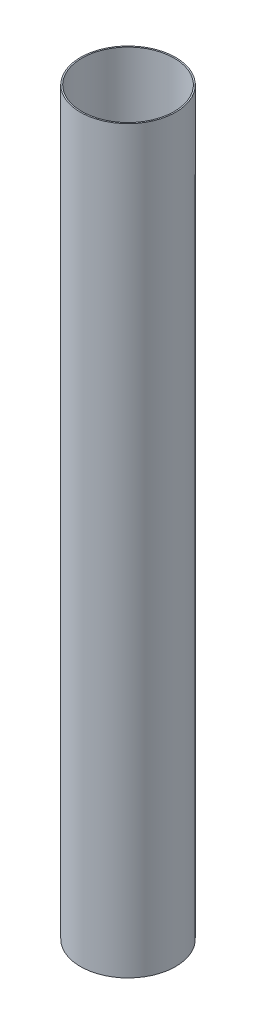
ISO-10303-21;
HEADER;
FILE_DESCRIPTION(('STEP AP214'),'2;1');
FILE_NAME('part.step','',(''),(''),'','','');
FILE_SCHEMA(('AUTOMOTIVE_DESIGN { 1 0 10303 214 1 1 1 1 }'));
ENDSEC;
DATA;
#1=APPLICATION_CONTEXT('core data for automotive mechanical design processes');
#2=APPLICATION_PROTOCOL_DEFINITION('international standard','automotive_design',2000,#1);
#3=PRODUCT_CONTEXT('',#1,'mechanical');
#4=PRODUCT('Part','Part','',(#3));
#5=PRODUCT_RELATED_PRODUCT_CATEGORY('part','',(#4));
#6=PRODUCT_DEFINITION_FORMATION('','',#4);
#7=PRODUCT_DEFINITION_CONTEXT('part definition',#1,'design');
#8=PRODUCT_DEFINITION('design','',#6,#7);
#9=PRODUCT_DEFINITION_SHAPE('','',#8);
#10=(LENGTH_UNIT() NAMED_UNIT(*) SI_UNIT(.MILLI.,.METRE.));
#11=(NAMED_UNIT(*) PLANE_ANGLE_UNIT() SI_UNIT($,.RADIAN.));
#12=(NAMED_UNIT(*) SI_UNIT($,.STERADIAN.) SOLID_ANGLE_UNIT());
#13=UNCERTAINTY_MEASURE_WITH_UNIT(LENGTH_MEASURE(1.E-05),#10,'distance_accuracy_value','');
#14=(GEOMETRIC_REPRESENTATION_CONTEXT(3) GLOBAL_UNCERTAINTY_ASSIGNED_CONTEXT((#13)) GLOBAL_UNIT_ASSIGNED_CONTEXT((#10,
#11,#12)) REPRESENTATION_CONTEXT('',''));
#15=CARTESIAN_POINT('',(0.,0.,0.));
#16=DIRECTION('',(0.,0.,1.));
#17=DIRECTION('',(1.,0.,0.));
#18=AXIS2_PLACEMENT_3D('',#15,#16,#17);
#19=CARTESIAN_POINT('',(0.,1219.2,0.));
#20=DIRECTION('',(0.,1.,0.));
#21=DIRECTION('',(0.,0.,1.));
#22=AXIS2_PLACEMENT_3D('',#19,#20,#21);
#23=PLANE('',#22);
#24=CARTESIAN_POINT('',(0.,1219.2,0.));
#25=DIRECTION('',(0.,1.,0.));
#26=DIRECTION('',(0.,0.,1.));
#27=AXIS2_PLACEMENT_3D('',#24,#25,#26);
#28=CIRCLE('',#27,78.4225);
#29=CARTESIAN_POINT('',(0.,1219.2,-78.4225));
#30=VERTEX_POINT('',#29);
#31=EDGE_CURVE('E10',#30,#30,#28,.T.);
#32=ORIENTED_EDGE('',*,*,#31,.T.);
#33=EDGE_LOOP('',(#32));
#34=FACE_BOUND('',#33,.T.);
#35=CARTESIAN_POINT('',(0.,1219.2,0.));
#36=DIRECTION('',(0.,1.,0.));
#37=DIRECTION('',(0.,0.,1.));
#38=AXIS2_PLACEMENT_3D('',#35,#36,#37);
#39=CIRCLE('',#38,76.2);
#40=CARTESIAN_POINT('',(0.,1219.2,-76.2));
#41=VERTEX_POINT('',#40);
#42=EDGE_CURVE('E46',#41,#41,#39,.T.);
#43=ORIENTED_EDGE('',*,*,#42,.F.);
#44=EDGE_LOOP('',(#43));
#45=FACE_BOUND('',#44,.T.);
#46=ADVANCED_FACE('F35',(#34,#45),#23,.T.);
#47=CARTESIAN_POINT('',(0.,0.,0.));
#48=DIRECTION('',(0.,1.,0.));
#49=DIRECTION('',(0.,0.,1.));
#50=AXIS2_PLACEMENT_3D('',#47,#48,#49);
#51=PLANE('',#50);
#52=CARTESIAN_POINT('',(0.,0.,0.));
#53=DIRECTION('',(0.,1.,0.));
#54=DIRECTION('',(0.,0.,1.));
#55=AXIS2_PLACEMENT_3D('',#52,#53,#54);
#56=CIRCLE('',#55,78.4225);
#57=CARTESIAN_POINT('',(0.,0.,-78.4225));
#58=VERTEX_POINT('',#57);
#59=EDGE_CURVE('E39',#58,#58,#56,.T.);
#60=ORIENTED_EDGE('',*,*,#59,.F.);
#61=EDGE_LOOP('',(#60));
#62=FACE_BOUND('',#61,.T.);
#63=CARTESIAN_POINT('',(0.,0.,0.));
#64=DIRECTION('',(0.,1.,0.));
#65=DIRECTION('',(0.,0.,1.));
#66=AXIS2_PLACEMENT_3D('',#63,#64,#65);
#67=CIRCLE('',#66,76.2);
#68=CARTESIAN_POINT('',(0.,0.,-76.2));
#69=VERTEX_POINT('',#68);
#70=EDGE_CURVE('E48',#69,#69,#67,.T.);
#71=ORIENTED_EDGE('',*,*,#70,.T.);
#72=EDGE_LOOP('',(#71));
#73=FACE_BOUND('',#72,.T.);
#74=ADVANCED_FACE('F58',(#62,#73),#51,.F.);
#75=CARTESIAN_POINT('',(0.,1219.2,0.));
#76=DIRECTION('',(0.,-1.,0.));
#77=DIRECTION('',(0.,0.,-1.));
#78=AXIS2_PLACEMENT_3D('',#75,#76,#77);
#79=CYLINDRICAL_SURFACE('',#78,78.4225);
#80=CARTESIAN_POINT('',(0.,1219.2,-78.4225));
#81=CARTESIAN_POINT('',(0.,1206.5,-78.4225));
#82=CARTESIAN_POINT('',(0.,1193.8,-78.4225));
#83=CARTESIAN_POINT('',(0.,1168.4,-78.4225));
#84=CARTESIAN_POINT('',(0.,1155.7,-78.4225));
#85=CARTESIAN_POINT('',(0.,1130.3,-78.4225));
#86=CARTESIAN_POINT('',(0.,1117.6,-78.4225));
#87=CARTESIAN_POINT('',(0.,1092.2,-78.4225));
#88=CARTESIAN_POINT('',(0.,1079.5,-78.4225));
#89=CARTESIAN_POINT('',(0.,1054.1,-78.4225));
#90=CARTESIAN_POINT('',(0.,1041.4,-78.4225));
#91=CARTESIAN_POINT('',(0.,1016.,-78.4225));
#92=CARTESIAN_POINT('',(0.,1003.3,-78.4225));
#93=CARTESIAN_POINT('',(0.,977.9,-78.4225));
#94=CARTESIAN_POINT('',(0.,965.2,-78.4225));
#95=CARTESIAN_POINT('',(0.,939.8,-78.4225));
#96=CARTESIAN_POINT('',(0.,927.1,-78.4225));
#97=CARTESIAN_POINT('',(0.,901.7,-78.4225));
#98=CARTESIAN_POINT('',(0.,889.,-78.4225));
#99=CARTESIAN_POINT('',(0.,863.6,-78.4225));
#100=CARTESIAN_POINT('',(0.,850.9,-78.4225));
#101=CARTESIAN_POINT('',(0.,825.5,-78.4225));
#102=CARTESIAN_POINT('',(0.,812.8,-78.4225));
#103=CARTESIAN_POINT('',(0.,787.4,-78.4225));
#104=CARTESIAN_POINT('',(0.,774.7,-78.4225));
#105=CARTESIAN_POINT('',(0.,749.3,-78.4225));
#106=CARTESIAN_POINT('',(0.,736.6,-78.4225));
#107=CARTESIAN_POINT('',(0.,711.2,-78.4225));
#108=CARTESIAN_POINT('',(0.,698.5,-78.4225));
#109=CARTESIAN_POINT('',(0.,673.1,-78.4225));
#110=CARTESIAN_POINT('',(0.,660.4,-78.4225));
#111=CARTESIAN_POINT('',(0.,635.,-78.4225));
#112=CARTESIAN_POINT('',(0.,622.3,-78.4225));
#113=CARTESIAN_POINT('',(0.,596.9,-78.4225));
#114=CARTESIAN_POINT('',(0.,584.2,-78.4225));
#115=CARTESIAN_POINT('',(0.,558.8,-78.4225));
#116=CARTESIAN_POINT('',(0.,546.1,-78.4225));
#117=CARTESIAN_POINT('',(0.,520.7,-78.4225));
#118=CARTESIAN_POINT('',(0.,508.,-78.4225));
#119=CARTESIAN_POINT('',(0.,482.6,-78.4225));
#120=CARTESIAN_POINT('',(0.,469.9,-78.4225));
#121=CARTESIAN_POINT('',(0.,444.5,-78.4225));
#122=CARTESIAN_POINT('',(0.,431.8,-78.4225));
#123=CARTESIAN_POINT('',(0.,406.4,-78.4225));
#124=CARTESIAN_POINT('',(0.,393.7,-78.4225));
#125=CARTESIAN_POINT('',(0.,368.3,-78.4225));
#126=CARTESIAN_POINT('',(0.,355.6,-78.4225));
#127=CARTESIAN_POINT('',(0.,330.2,-78.4225));
#128=CARTESIAN_POINT('',(0.,317.5,-78.4225));
#129=CARTESIAN_POINT('',(0.,292.1,-78.4225));
#130=CARTESIAN_POINT('',(0.,279.4,-78.4225));
#131=CARTESIAN_POINT('',(0.,254.,-78.4225));
#132=CARTESIAN_POINT('',(0.,241.3,-78.4225));
#133=CARTESIAN_POINT('',(0.,215.9,-78.4225));
#134=CARTESIAN_POINT('',(0.,203.2,-78.4225));
#135=CARTESIAN_POINT('',(0.,177.8,-78.4225));
#136=CARTESIAN_POINT('',(0.,165.1,-78.4225));
#137=CARTESIAN_POINT('',(0.,139.7,-78.4225));
#138=CARTESIAN_POINT('',(0.,127.,-78.4225));
#139=CARTESIAN_POINT('',(0.,101.6,-78.4225));
#140=CARTESIAN_POINT('',(0.,88.9,-78.4225));
#141=CARTESIAN_POINT('',(0.,63.5,-78.4225));
#142=CARTESIAN_POINT('',(0.,50.8,-78.4225));
#143=CARTESIAN_POINT('',(0.,25.4,-78.4225));
#144=CARTESIAN_POINT('',(0.,12.7,-78.4225));
#145=CARTESIAN_POINT('',(0.,0.,-78.4225));
#146=B_SPLINE_CURVE_WITH_KNOTS('',3,(#80,#81,#82,#83,#84,#85,#86,#87,#88,#89,#90,#91,#92,#93,
#94,#95,#96,#97,#98,#99,#100,#101,#102,#103,#104,#105,#106,#107,#108,#109,#110,#111,#112,#113,
#114,#115,#116,#117,#118,#119,#120,#121,#122,#123,#124,#125,#126,#127,#128,#129,#130,#131,#132,
#133,#134,#135,#136,#137,#138,#139,#140,#141,#142,#143,#144,#145),.UNSPECIFIED.,.F.,.F.,(4,2,2,
2,2,2,2,2,2,2,2,2,2,2,2,2,2,2,2,2,2,2,2,2,2,2,2,2,2,2,2,2,4),(0.,38.1,76.2,114.3,152.4,190.5,
228.6,266.7,304.8,342.9,381.,419.1,457.2,495.3,533.4,571.5,609.6,647.7,685.8,723.9,762.,800.1,
838.2,876.3,914.4,952.5,990.6,1028.7,1066.8,1104.9,1143.,1181.1,1219.2),.UNSPECIFIED.);
#147=EDGE_CURVE('BSEAM37',#30,#58,#146,.T.);
#148=ORIENTED_EDGE('',*,*,#31,.F.);
#149=ORIENTED_EDGE('',*,*,#59,.T.);
#150=ORIENTED_EDGE('',*,*,#147,.T.);
#151=ORIENTED_EDGE('',*,*,#147,.F.);
#152=EDGE_LOOP('',(#148,#150,#149,#151));
#153=FACE_BOUND('',#152,.T.);
#154=ADVANCED_FACE('F37',(#153),#79,.T.);
#155=CARTESIAN_POINT('',(0.,1219.2,0.));
#156=DIRECTION('',(0.,-1.,0.));
#157=DIRECTION('',(0.,0.,-1.));
#158=AXIS2_PLACEMENT_3D('',#155,#156,#157);
#159=CYLINDRICAL_SURFACE('',#158,76.2);
#160=CARTESIAN_POINT('',(0.,1219.2,-76.2));
#161=CARTESIAN_POINT('',(0.,1206.5,-76.2));
#162=CARTESIAN_POINT('',(0.,1193.8,-76.2));
#163=CARTESIAN_POINT('',(0.,1168.4,-76.2));
#164=CARTESIAN_POINT('',(0.,1155.7,-76.2));
#165=CARTESIAN_POINT('',(0.,1130.3,-76.2));
#166=CARTESIAN_POINT('',(0.,1117.6,-76.2));
#167=CARTESIAN_POINT('',(0.,1092.2,-76.2));
#168=CARTESIAN_POINT('',(0.,1079.5,-76.2));
#169=CARTESIAN_POINT('',(0.,1054.1,-76.2));
#170=CARTESIAN_POINT('',(0.,1041.4,-76.2));
#171=CARTESIAN_POINT('',(0.,1016.,-76.2));
#172=CARTESIAN_POINT('',(0.,1003.3,-76.2));
#173=CARTESIAN_POINT('',(0.,977.9,-76.2));
#174=CARTESIAN_POINT('',(0.,965.2,-76.2));
#175=CARTESIAN_POINT('',(0.,939.8,-76.2));
#176=CARTESIAN_POINT('',(0.,927.1,-76.2));
#177=CARTESIAN_POINT('',(0.,901.7,-76.2));
#178=CARTESIAN_POINT('',(0.,889.,-76.2));
#179=CARTESIAN_POINT('',(0.,863.6,-76.2));
#180=CARTESIAN_POINT('',(0.,850.9,-76.2));
#181=CARTESIAN_POINT('',(0.,825.5,-76.2));
#182=CARTESIAN_POINT('',(0.,812.8,-76.2));
#183=CARTESIAN_POINT('',(0.,787.4,-76.2));
#184=CARTESIAN_POINT('',(0.,774.7,-76.2));
#185=CARTESIAN_POINT('',(0.,749.3,-76.2));
#186=CARTESIAN_POINT('',(0.,736.6,-76.2));
#187=CARTESIAN_POINT('',(0.,711.2,-76.2));
#188=CARTESIAN_POINT('',(0.,698.5,-76.2));
#189=CARTESIAN_POINT('',(0.,673.1,-76.2));
#190=CARTESIAN_POINT('',(0.,660.4,-76.2));
#191=CARTESIAN_POINT('',(0.,635.,-76.2));
#192=CARTESIAN_POINT('',(0.,622.3,-76.2));
#193=CARTESIAN_POINT('',(0.,596.9,-76.2));
#194=CARTESIAN_POINT('',(0.,584.2,-76.2));
#195=CARTESIAN_POINT('',(0.,558.8,-76.2));
#196=CARTESIAN_POINT('',(0.,546.1,-76.2));
#197=CARTESIAN_POINT('',(0.,520.7,-76.2));
#198=CARTESIAN_POINT('',(0.,508.,-76.2));
#199=CARTESIAN_POINT('',(0.,482.6,-76.2));
#200=CARTESIAN_POINT('',(0.,469.9,-76.2));
#201=CARTESIAN_POINT('',(0.,444.5,-76.2));
#202=CARTESIAN_POINT('',(0.,431.8,-76.2));
#203=CARTESIAN_POINT('',(0.,406.4,-76.2));
#204=CARTESIAN_POINT('',(0.,393.7,-76.2));
#205=CARTESIAN_POINT('',(0.,368.3,-76.2));
#206=CARTESIAN_POINT('',(0.,355.6,-76.2));
#207=CARTESIAN_POINT('',(0.,330.2,-76.2));
#208=CARTESIAN_POINT('',(0.,317.5,-76.2));
#209=CARTESIAN_POINT('',(0.,292.1,-76.2));
#210=CARTESIAN_POINT('',(0.,279.4,-76.2));
#211=CARTESIAN_POINT('',(0.,254.,-76.2));
#212=CARTESIAN_POINT('',(0.,241.3,-76.2));
#213=CARTESIAN_POINT('',(0.,215.9,-76.2));
#214=CARTESIAN_POINT('',(0.,203.2,-76.2));
#215=CARTESIAN_POINT('',(0.,177.8,-76.2));
#216=CARTESIAN_POINT('',(0.,165.1,-76.2));
#217=CARTESIAN_POINT('',(0.,139.7,-76.2));
#218=CARTESIAN_POINT('',(0.,127.,-76.2));
#219=CARTESIAN_POINT('',(0.,101.6,-76.2));
#220=CARTESIAN_POINT('',(0.,88.9,-76.2));
#221=CARTESIAN_POINT('',(0.,63.5,-76.2));
#222=CARTESIAN_POINT('',(0.,50.8,-76.2));
#223=CARTESIAN_POINT('',(0.,25.4,-76.2));
#224=CARTESIAN_POINT('',(0.,12.7,-76.2));
#225=CARTESIAN_POINT('',(0.,0.,-76.2));
#226=B_SPLINE_CURVE_WITH_KNOTS('',3,(#160,#161,#162,#163,#164,#165,#166,#167,#168,#169,#170,
#171,#172,#173,#174,#175,#176,#177,#178,#179,#180,#181,#182,#183,#184,#185,#186,#187,#188,#189,
#190,#191,#192,#193,#194,#195,#196,#197,#198,#199,#200,#201,#202,#203,#204,#205,#206,#207,#208,
#209,#210,#211,#212,#213,#214,#215,#216,#217,#218,#219,#220,#221,#222,#223,#224,#225),
.UNSPECIFIED.,.F.,.F.,(4,2,2,2,2,2,2,2,2,2,2,2,2,2,2,2,2,2,2,2,2,2,2,2,2,2,2,2,2,2,2,2,4),(0.,
38.1,76.2,114.3,152.4,190.5,228.6,266.7,304.8,342.9,381.,419.1,457.2,495.3,533.4,571.5,609.6,
647.7,685.8,723.9,762.,800.1,838.2,876.3,914.4,952.5,990.6,1028.7,1066.8,1104.9,1143.,1181.1,
1219.2),.UNSPECIFIED.);
#227=EDGE_CURVE('BSEAM54',#41,#69,#226,.T.);
#228=ORIENTED_EDGE('',*,*,#42,.T.);
#229=ORIENTED_EDGE('',*,*,#70,.F.);
#230=ORIENTED_EDGE('',*,*,#227,.T.);
#231=ORIENTED_EDGE('',*,*,#227,.F.);
#232=EDGE_LOOP('',(#228,#230,#229,#231));
#233=FACE_BOUND('',#232,.T.);
#234=ADVANCED_FACE('F54',(#233),#159,.F.);
#235=CLOSED_SHELL('',(#46,#74,#154,#234));
#236=MANIFOLD_SOLID_BREP('B2',#235);
#237=ADVANCED_BREP_SHAPE_REPRESENTATION('',(#18,#236),#14);
#238=SHAPE_DEFINITION_REPRESENTATION(#9,#237);
ENDSEC;
END-ISO-10303-21;
